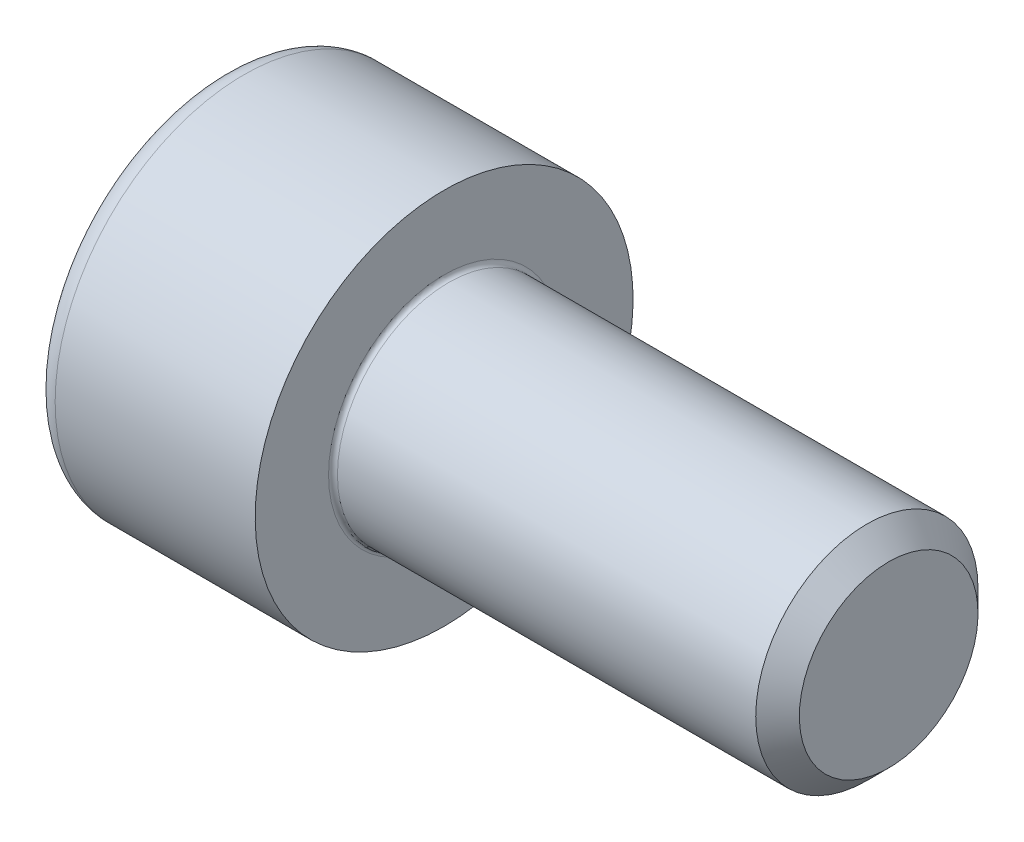
ISO-10303-21;
HEADER;
FILE_DESCRIPTION(('STEP AP214'),'2;1');
FILE_NAME('part.step','',(''),(''),'','','');
FILE_SCHEMA(('AUTOMOTIVE_DESIGN { 1 0 10303 214 1 1 1 1 }'));
ENDSEC;
DATA;
#1=APPLICATION_CONTEXT('core data for automotive mechanical design processes');
#2=APPLICATION_PROTOCOL_DEFINITION('international standard','automotive_design',2000,#1);
#3=PRODUCT_CONTEXT('',#1,'mechanical');
#4=PRODUCT('Part','Part','',(#3));
#5=PRODUCT_RELATED_PRODUCT_CATEGORY('part','',(#4));
#6=PRODUCT_DEFINITION_FORMATION('','',#4);
#7=PRODUCT_DEFINITION_CONTEXT('part definition',#1,'design');
#8=PRODUCT_DEFINITION('design','',#6,#7);
#9=PRODUCT_DEFINITION_SHAPE('','',#8);
#10=(LENGTH_UNIT() NAMED_UNIT(*) SI_UNIT(.MILLI.,.METRE.));
#11=(NAMED_UNIT(*) PLANE_ANGLE_UNIT() SI_UNIT($,.RADIAN.));
#12=(NAMED_UNIT(*) SI_UNIT($,.STERADIAN.) SOLID_ANGLE_UNIT());
#13=UNCERTAINTY_MEASURE_WITH_UNIT(LENGTH_MEASURE(1.E-05),#10,'distance_accuracy_value','');
#14=(GEOMETRIC_REPRESENTATION_CONTEXT(3) GLOBAL_UNCERTAINTY_ASSIGNED_CONTEXT((#13)) GLOBAL_UNIT_ASSIGNED_CONTEXT((#10,
#11,#12)) REPRESENTATION_CONTEXT('',''));
#15=CARTESIAN_POINT('',(0.,0.,0.));
#16=DIRECTION('',(0.,0.,1.));
#17=DIRECTION('',(1.,0.,0.));
#18=AXIS2_PLACEMENT_3D('',#15,#16,#17);
#19=CARTESIAN_POINT('',(-1.83333333333333,0.,0.));
#20=DIRECTION('',(-1.,0.,0.));
#21=DIRECTION('',(0.,1.,0.));
#22=AXIS2_PLACEMENT_3D('',#19,#20,#21);
#23=CONICAL_SURFACE('',#22,1.15470053837925,1.0471975511966);
#24=CARTESIAN_POINT('',(-1.16666666666667,0.,0.));
#25=VERTEX_POINT('',#24);
#26=VERTEX_LOOP('',#25);
#27=FACE_BOUND('',#26,.T.);
#28=CARTESIAN_POINT('',(-2.32136720504591,-2.,0.));
#29=CARTESIAN_POINT('',(-2.32136720504591,-2.,0.535898384862279));
#30=CARTESIAN_POINT('',(-2.5,-2.,1.15470053837933));
#31=(BOUNDED_CURVE() B_SPLINE_CURVE(2,(#28,#29,#30),.UNSPECIFIED.,.F.,
.F.) B_SPLINE_CURVE_WITH_KNOTS((3,3),(0.1168436138078,0.2336872276156),
.UNSPECIFIED.) CURVE() GEOMETRIC_REPRESENTATION_ITEM() RATIONAL_B_SPLINE_CURVE((1.07735026918963,
1.07735026918963,1.)) REPRESENTATION_ITEM(''));
#32=CARTESIAN_POINT('',(-2.32136720504591,-2.,0.));
#33=VERTEX_POINT('',#32);
#34=CARTESIAN_POINT('',(-2.5,-2.,1.15470053837925));
#35=VERTEX_POINT('',#34);
#36=EDGE_CURVE('E29',#33,#35,#31,.T.);
#37=ORIENTED_EDGE('',*,*,#36,.T.);
#38=CARTESIAN_POINT('',(-2.5,-2.00000000000007,1.15470053837921));
#39=CARTESIAN_POINT('',(-2.16666666666664,-1.,1.73205080756888));
#40=CARTESIAN_POINT('',(-2.5,0.,2.30940107675854));
#41=(BOUNDED_CURVE() B_SPLINE_CURVE(2,(#38,#39,#40),.UNSPECIFIED.,.F.,
.F.) B_SPLINE_CURVE_WITH_KNOTS((3,3),(0.,0.2336872276156),
.UNSPECIFIED.) CURVE() GEOMETRIC_REPRESENTATION_ITEM() RATIONAL_B_SPLINE_CURVE((1.,
1.15470053837927,1.)) REPRESENTATION_ITEM(''));
#42=CARTESIAN_POINT('',(-2.5,0.,2.3094010767585));
#43=VERTEX_POINT('',#42);
#44=EDGE_CURVE('E11',#35,#43,#41,.T.);
#45=ORIENTED_EDGE('',*,*,#44,.T.);
#46=CARTESIAN_POINT('',(-2.5,0.,2.30940107675854));
#47=CARTESIAN_POINT('',(-2.16666666666664,1.,1.73205080756888));
#48=CARTESIAN_POINT('',(-2.5,2.00000000000007,1.15470053837921));
#49=(BOUNDED_CURVE() B_SPLINE_CURVE(2,(#46,#47,#48),.UNSPECIFIED.,.F.,
.F.) B_SPLINE_CURVE_WITH_KNOTS((3,3),(0.,0.2336872276156),
.UNSPECIFIED.) CURVE() GEOMETRIC_REPRESENTATION_ITEM() RATIONAL_B_SPLINE_CURVE((1.,
1.15470053837927,1.)) REPRESENTATION_ITEM(''));
#50=CARTESIAN_POINT('',(-2.5,2.,1.15470053837925));
#51=VERTEX_POINT('',#50);
#52=EDGE_CURVE('E92',#43,#51,#49,.T.);
#53=ORIENTED_EDGE('',*,*,#52,.T.);
#54=CARTESIAN_POINT('',(-2.5,2.,1.15470053837933));
#55=CARTESIAN_POINT('',(-2.16666666666664,2.,0.));
#56=CARTESIAN_POINT('',(-2.5,2.,-1.15470053837933));
#57=(BOUNDED_CURVE() B_SPLINE_CURVE(2,(#54,#55,#56),.UNSPECIFIED.,.F.,
.F.) B_SPLINE_CURVE_WITH_KNOTS((3,3),(0.,0.2336872276156),
.UNSPECIFIED.) CURVE() GEOMETRIC_REPRESENTATION_ITEM() RATIONAL_B_SPLINE_CURVE((1.,
1.15470053837927,1.)) REPRESENTATION_ITEM(''));
#58=CARTESIAN_POINT('',(-2.5,2.,-1.15470053837925));
#59=VERTEX_POINT('',#58);
#60=EDGE_CURVE('E114',#51,#59,#57,.T.);
#61=ORIENTED_EDGE('',*,*,#60,.T.);
#62=CARTESIAN_POINT('',(-2.5,2.00000000000007,-1.15470053837921));
#63=CARTESIAN_POINT('',(-2.16666666666664,1.,-1.73205080756888));
#64=CARTESIAN_POINT('',(-2.5,0.,-2.30940107675854));
#65=(BOUNDED_CURVE() B_SPLINE_CURVE(2,(#62,#63,#64),.UNSPECIFIED.,.F.,
.F.) B_SPLINE_CURVE_WITH_KNOTS((3,3),(0.,0.2336872276156),
.UNSPECIFIED.) CURVE() GEOMETRIC_REPRESENTATION_ITEM() RATIONAL_B_SPLINE_CURVE((1.,
1.15470053837927,1.)) REPRESENTATION_ITEM(''));
#66=CARTESIAN_POINT('',(-2.5,0.,-2.3094010767585));
#67=VERTEX_POINT('',#66);
#68=EDGE_CURVE('E169',#59,#67,#65,.T.);
#69=ORIENTED_EDGE('',*,*,#68,.T.);
#70=CARTESIAN_POINT('',(-2.5,0.,-2.30940107675854));
#71=CARTESIAN_POINT('',(-2.16666666666664,-1.,-1.73205080756888));
#72=CARTESIAN_POINT('',(-2.5,-2.00000000000007,-1.15470053837921));
#73=(BOUNDED_CURVE() B_SPLINE_CURVE(2,(#70,#71,#72),.UNSPECIFIED.,.F.,
.F.) B_SPLINE_CURVE_WITH_KNOTS((3,3),(0.,0.2336872276156),
.UNSPECIFIED.) CURVE() GEOMETRIC_REPRESENTATION_ITEM() RATIONAL_B_SPLINE_CURVE((1.,
1.15470053837927,1.)) REPRESENTATION_ITEM(''));
#74=CARTESIAN_POINT('',(-2.5,-2.,-1.15470053837925));
#75=VERTEX_POINT('',#74);
#76=EDGE_CURVE('E188',#67,#75,#73,.T.);
#77=ORIENTED_EDGE('',*,*,#76,.T.);
#78=CARTESIAN_POINT('',(-2.5,-2.,-1.15470053837933));
#79=CARTESIAN_POINT('',(-2.32136720504591,-2.,-0.535898384862279));
#80=CARTESIAN_POINT('',(-2.32136720504591,-2.,0.));
#81=(BOUNDED_CURVE() B_SPLINE_CURVE(2,(#78,#79,#80),.UNSPECIFIED.,.F.,
.F.) B_SPLINE_CURVE_WITH_KNOTS((3,3),(0.,0.1168436138078),
.UNSPECIFIED.) CURVE() GEOMETRIC_REPRESENTATION_ITEM() RATIONAL_B_SPLINE_CURVE((1.,
1.07735026918963,1.07735026918963)) REPRESENTATION_ITEM(''));
#82=EDGE_CURVE('E102',#75,#33,#81,.T.);
#83=ORIENTED_EDGE('',*,*,#82,.T.);
#84=EDGE_LOOP('',(#37,#45,#53,#61,#69,#77,#83));
#85=FACE_BOUND('',#84,.T.);
#86=ADVANCED_FACE('F17',(#27,#85),#23,.F.);
#87=CARTESIAN_POINT('',(-5.,-2.,1.15470053837925));
#88=DIRECTION('',(0.,-0.5,0.866025403784439));
#89=DIRECTION('',(-1.,0.,0.));
#90=AXIS2_PLACEMENT_3D('',#87,#88,#89);
#91=PLANE('',#90);
#92=ORIENTED_EDGE('',*,*,#44,.F.);
#93=DIRECTION('',(-1.,0.,0.));
#94=VECTOR('',#93,1.);
#95=CARTESIAN_POINT('',(-3.75,-2.,1.15470053837925));
#96=LINE('',#95,#94);
#97=CARTESIAN_POINT('',(-5.,-2.,1.15470053837925));
#98=VERTEX_POINT('',#97);
#99=EDGE_CURVE('E128',#35,#98,#96,.T.);
#100=ORIENTED_EDGE('',*,*,#99,.T.);
#101=DIRECTION('',(0.,-0.866025403784439,-0.5));
#102=VECTOR('',#101,1.);
#103=CARTESIAN_POINT('',(-5.,-1.5,1.44337567297407));
#104=LINE('',#103,#102);
#105=CARTESIAN_POINT('',(-5.,0.,2.3094010767585));
#106=VERTEX_POINT('',#105);
#107=EDGE_CURVE('E99',#106,#98,#104,.T.);
#108=ORIENTED_EDGE('',*,*,#107,.F.);
#109=DIRECTION('',(1.,0.,0.));
#110=VECTOR('',#109,1.);
#111=CARTESIAN_POINT('',(-3.75,0.,2.3094010767585));
#112=LINE('',#111,#110);
#113=EDGE_CURVE('E100',#106,#43,#112,.T.);
#114=ORIENTED_EDGE('',*,*,#113,.T.);
#115=EDGE_LOOP('',(#92,#100,#108,#114));
#116=FACE_BOUND('',#115,.T.);
#117=ADVANCED_FACE('F19',(#116),#91,.F.);
#118=CARTESIAN_POINT('',(-5.,-2.,-1.15470053837925));
#119=DIRECTION('',(0.,-1.,0.));
#120=DIRECTION('',(-1.,0.,0.));
#121=AXIS2_PLACEMENT_3D('',#118,#119,#120);
#122=PLANE('',#121);
#123=ORIENTED_EDGE('',*,*,#82,.F.);
#124=DIRECTION('',(-1.,0.,0.));
#125=VECTOR('',#124,1.);
#126=CARTESIAN_POINT('',(-3.75,-2.,-1.15470053837925));
#127=LINE('',#126,#125);
#128=CARTESIAN_POINT('',(-5.,-2.,-1.15470053837925));
#129=VERTEX_POINT('',#128);
#130=EDGE_CURVE('E177',#75,#129,#127,.T.);
#131=ORIENTED_EDGE('',*,*,#130,.T.);
#132=DIRECTION('',(0.,0.,-1.));
#133=VECTOR('',#132,1.);
#134=CARTESIAN_POINT('',(-5.,-2.,-0.577350269189625));
#135=LINE('',#134,#133);
#136=EDGE_CURVE('E218',#98,#129,#135,.T.);
#137=ORIENTED_EDGE('',*,*,#136,.F.);
#138=ORIENTED_EDGE('',*,*,#99,.F.);
#139=ORIENTED_EDGE('',*,*,#36,.F.);
#140=EDGE_LOOP('',(#123,#131,#137,#138,#139));
#141=FACE_BOUND('',#140,.T.);
#142=ADVANCED_FACE('F405',(#141),#122,.F.);
#143=CARTESIAN_POINT('',(-5.,0.,2.3094010767585));
#144=DIRECTION('',(0.,0.5,0.866025403784439));
#145=DIRECTION('',(1.,0.,0.));
#146=AXIS2_PLACEMENT_3D('',#143,#144,#145);
#147=PLANE('',#146);
#148=ORIENTED_EDGE('',*,*,#52,.F.);
#149=ORIENTED_EDGE('',*,*,#113,.F.);
#150=DIRECTION('',(0.,-0.866025403784439,0.5));
#151=VECTOR('',#150,1.);
#152=CARTESIAN_POINT('',(-5.,0.5,2.02072594216369));
#153=LINE('',#152,#151);
#154=CARTESIAN_POINT('',(-5.,2.,1.15470053837925));
#155=VERTEX_POINT('',#154);
#156=EDGE_CURVE('E228',#155,#106,#153,.T.);
#157=ORIENTED_EDGE('',*,*,#156,.F.);
#158=DIRECTION('',(-1.,0.,0.));
#159=VECTOR('',#158,1.);
#160=CARTESIAN_POINT('',(-3.75,2.,1.15470053837925));
#161=LINE('',#160,#159);
#162=EDGE_CURVE('E110',#51,#155,#161,.T.);
#163=ORIENTED_EDGE('',*,*,#162,.F.);
#164=EDGE_LOOP('',(#148,#149,#157,#163));
#165=FACE_BOUND('',#164,.T.);
#166=ADVANCED_FACE('F106',(#165),#147,.F.);
#167=CARTESIAN_POINT('',(-5.,2.,1.15470053837925));
#168=DIRECTION('',(0.,1.,0.));
#169=DIRECTION('',(0.,0.,-1.));
#170=AXIS2_PLACEMENT_3D('',#167,#168,#169);
#171=PLANE('',#170);
#172=ORIENTED_EDGE('',*,*,#60,.F.);
#173=ORIENTED_EDGE('',*,*,#162,.T.);
#174=DIRECTION('',(0.,0.,1.));
#175=VECTOR('',#174,1.);
#176=CARTESIAN_POINT('',(-5.,2.,0.577350269189625));
#177=LINE('',#176,#175);
#178=CARTESIAN_POINT('',(-5.,2.,-1.15470053837925));
#179=VERTEX_POINT('',#178);
#180=EDGE_CURVE('E235',#179,#155,#177,.T.);
#181=ORIENTED_EDGE('',*,*,#180,.F.);
#182=DIRECTION('',(-1.,0.,0.));
#183=VECTOR('',#182,1.);
#184=CARTESIAN_POINT('',(-3.75,2.,-1.15470053837925));
#185=LINE('',#184,#183);
#186=EDGE_CURVE('E164',#59,#179,#185,.T.);
#187=ORIENTED_EDGE('',*,*,#186,.F.);
#188=EDGE_LOOP('',(#172,#173,#181,#187));
#189=FACE_BOUND('',#188,.T.);
#190=ADVANCED_FACE('F415',(#189),#171,.F.);
#191=CARTESIAN_POINT('',(-5.,2.,-1.15470053837925));
#192=DIRECTION('',(0.,0.5,-0.866025403784439));
#193=DIRECTION('',(-1.,0.,0.));
#194=AXIS2_PLACEMENT_3D('',#191,#192,#193);
#195=PLANE('',#194);
#196=ORIENTED_EDGE('',*,*,#68,.F.);
#197=ORIENTED_EDGE('',*,*,#186,.T.);
#198=DIRECTION('',(0.,0.866025403784439,0.5));
#199=VECTOR('',#198,1.);
#200=CARTESIAN_POINT('',(-5.,1.5,-1.44337567297407));
#201=LINE('',#200,#199);
#202=CARTESIAN_POINT('',(-5.,0.,-2.3094010767585));
#203=VERTEX_POINT('',#202);
#204=EDGE_CURVE('E205',#203,#179,#201,.T.);
#205=ORIENTED_EDGE('',*,*,#204,.F.);
#206=DIRECTION('',(-1.,0.,0.));
#207=VECTOR('',#206,1.);
#208=CARTESIAN_POINT('',(-3.75,0.,-2.3094010767585));
#209=LINE('',#208,#207);
#210=EDGE_CURVE('E182',#67,#203,#209,.T.);
#211=ORIENTED_EDGE('',*,*,#210,.F.);
#212=EDGE_LOOP('',(#196,#197,#205,#211));
#213=FACE_BOUND('',#212,.T.);
#214=ADVANCED_FACE('F420',(#213),#195,.F.);
#215=CARTESIAN_POINT('',(-5.,0.,-2.3094010767585));
#216=DIRECTION('',(0.,-0.5,-0.866025403784439));
#217=DIRECTION('',(0.,-0.866025403784439,0.5));
#218=AXIS2_PLACEMENT_3D('',#215,#216,#217);
#219=PLANE('',#218);
#220=ORIENTED_EDGE('',*,*,#76,.F.);
#221=ORIENTED_EDGE('',*,*,#210,.T.);
#222=DIRECTION('',(0.,0.866025403784439,-0.5));
#223=VECTOR('',#222,1.);
#224=CARTESIAN_POINT('',(-5.,-0.5,-2.02072594216369));
#225=LINE('',#224,#223);
#226=EDGE_CURVE('E210',#129,#203,#225,.T.);
#227=ORIENTED_EDGE('',*,*,#226,.F.);
#228=ORIENTED_EDGE('',*,*,#130,.F.);
#229=EDGE_LOOP('',(#220,#221,#227,#228));
#230=FACE_BOUND('',#229,.T.);
#231=ADVANCED_FACE('F416',(#230),#219,.F.);
#232=CARTESIAN_POINT('',(-2.5,0.,0.));
#233=DIRECTION('',(1.,0.,0.));
#234=DIRECTION('',(0.,1.,0.));
#235=AXIS2_PLACEMENT_3D('',#232,#233,#234);
#236=CYLINDRICAL_SURFACE('',#235,4.25);
#237=CARTESIAN_POINT('',(0.,0.,0.));
#238=DIRECTION('',(1.,0.,0.));
#239=DIRECTION('',(0.,1.,0.));
#240=AXIS2_PLACEMENT_3D('',#237,#238,#239);
#241=CIRCLE('',#240,4.25);
#242=CARTESIAN_POINT('',(0.,-4.25,0.));
#243=VERTEX_POINT('',#242);
#244=EDGE_CURVE('E266',#243,#243,#241,.T.);
#245=ORIENTED_EDGE('',*,*,#244,.F.);
#246=DIRECTION('',(-1.,0.,0.));
#247=VECTOR('',#246,1.);
#248=CARTESIAN_POINT('',(-2.50000000000004,-4.25,0.));
#249=LINE('',#248,#247);
#250=CARTESIAN_POINT('',(-4.5,-4.25,0.));
#251=VERTEX_POINT('',#250);
#252=EDGE_CURVE('E194',#243,#251,#249,.T.);
#253=ORIENTED_EDGE('',*,*,#252,.T.);
#254=CARTESIAN_POINT('',(-4.5,0.,0.));
#255=DIRECTION('',(-1.,0.,0.));
#256=DIRECTION('',(0.,-1.,0.));
#257=AXIS2_PLACEMENT_3D('',#254,#255,#256);
#258=CIRCLE('',#257,4.25);
#259=CARTESIAN_POINT('',(-4.5,0.,4.25));
#260=VERTEX_POINT('',#259);
#261=EDGE_CURVE('E250',#260,#251,#258,.T.);
#262=ORIENTED_EDGE('',*,*,#261,.F.);
#263=CARTESIAN_POINT('',(-4.5,0.,0.));
#264=DIRECTION('',(-1.,0.,0.));
#265=DIRECTION('',(0.,-1.,0.));
#266=AXIS2_PLACEMENT_3D('',#263,#264,#265);
#267=CIRCLE('',#266,4.25);
#268=EDGE_CURVE('E241',#251,#260,#267,.T.);
#269=ORIENTED_EDGE('',*,*,#268,.F.);
#270=ORIENTED_EDGE('',*,*,#252,.F.);
#271=EDGE_LOOP('',(#245,#253,#262,#269,#270));
#272=FACE_BOUND('',#271,.T.);
#273=ADVANCED_FACE('F379',(#272),#236,.T.);
#274=CARTESIAN_POINT('',(-5.,3.27970053837925,0.));
#275=DIRECTION('',(-1.,0.,0.));
#276=DIRECTION('',(0.,1.,0.));
#277=AXIS2_PLACEMENT_3D('',#274,#275,#276);
#278=PLANE('',#277);
#279=ORIENTED_EDGE('',*,*,#180,.T.);
#280=ORIENTED_EDGE('',*,*,#156,.T.);
#281=ORIENTED_EDGE('',*,*,#107,.T.);
#282=ORIENTED_EDGE('',*,*,#136,.T.);
#283=ORIENTED_EDGE('',*,*,#226,.T.);
#284=ORIENTED_EDGE('',*,*,#204,.T.);
#285=EDGE_LOOP('',(#279,#280,#281,#282,#283,#284));
#286=FACE_BOUND('',#285,.T.);
#287=CARTESIAN_POINT('',(-5.,0.,0.));
#288=DIRECTION('',(1.,0.,0.));
#289=DIRECTION('',(0.,-1.,0.));
#290=AXIS2_PLACEMENT_3D('',#287,#288,#289);
#291=CIRCLE('',#290,3.75);
#292=CARTESIAN_POINT('',(-5.,0.,3.75));
#293=VERTEX_POINT('',#292);
#294=EDGE_CURVE('E240',#293,#293,#291,.T.);
#295=ORIENTED_EDGE('',*,*,#294,.F.);
#296=EDGE_LOOP('',(#295));
#297=FACE_BOUND('',#296,.T.);
#298=ADVANCED_FACE('F406',(#286,#297),#278,.T.);
#299=CARTESIAN_POINT('',(-4.5,0.,0.));
#300=DIRECTION('',(1.,0.,0.));
#301=DIRECTION('',(0.,0.,-1.));
#302=AXIS2_PLACEMENT_3D('',#299,#300,#301);
#303=TOROIDAL_SURFACE('',#302,3.75,0.5);
#304=ORIENTED_EDGE('',*,*,#261,.T.);
#305=ORIENTED_EDGE('',*,*,#268,.T.);
#306=CARTESIAN_POINT('',(-4.5,0.,3.75));
#307=DIRECTION('',(0.,-1.,0.));
#308=DIRECTION('',(0.,0.,1.));
#309=AXIS2_PLACEMENT_3D('',#306,#307,#308);
#310=CIRCLE('',#309,0.5);
#311=EDGE_CURVE('E246',#260,#293,#310,.T.);
#312=ORIENTED_EDGE('',*,*,#311,.T.);
#313=ORIENTED_EDGE('',*,*,#294,.T.);
#314=ORIENTED_EDGE('',*,*,#311,.F.);
#315=EDGE_LOOP('',(#304,#305,#312,#313,#314));
#316=FACE_BOUND('',#315,.T.);
#317=ADVANCED_FACE('F383',(#316),#303,.T.);
#318=CARTESIAN_POINT('',(10.,1.25,0.));
#319=DIRECTION('',(1.,0.,0.));
#320=DIRECTION('',(0.,1.,0.));
#321=AXIS2_PLACEMENT_3D('',#318,#319,#320);
#322=PLANE('',#321);
#323=CARTESIAN_POINT('',(10.,0.,0.));
#324=DIRECTION('',(-1.,0.,0.));
#325=DIRECTION('',(0.,-1.,0.));
#326=AXIS2_PLACEMENT_3D('',#323,#324,#325);
#327=CIRCLE('',#326,2.00924);
#328=CARTESIAN_POINT('',(10.,2.00924,0.));
#329=VERTEX_POINT('',#328);
#330=EDGE_CURVE('E268',#329,#329,#327,.T.);
#331=ORIENTED_EDGE('',*,*,#330,.F.);
#332=EDGE_LOOP('',(#331));
#333=FACE_BOUND('',#332,.T.);
#334=ADVANCED_FACE('F499',(#333),#322,.T.);
#335=CARTESIAN_POINT('',(9.75462,0.,0.));
#336=DIRECTION('',(-1.,0.,0.));
#337=DIRECTION('',(0.,-1.,0.));
#338=AXIS2_PLACEMENT_3D('',#335,#336,#337);
#339=CONICAL_SURFACE('',#338,2.25462,0.785398163397448);
#340=ORIENTED_EDGE('',*,*,#330,.T.);
#341=DIRECTION('',(-0.707106781186562,0.707106781186533,0.));
#342=VECTOR('',#341,1.);
#343=CARTESIAN_POINT('',(9.75462,2.25462,0.));
#344=LINE('',#343,#342);
#345=CARTESIAN_POINT('',(9.50924,2.5,0.));
#346=VERTEX_POINT('',#345);
#347=EDGE_CURVE('E256',#329,#346,#344,.T.);
#348=ORIENTED_EDGE('',*,*,#347,.T.);
#349=CARTESIAN_POINT('',(9.50924,0.,0.));
#350=DIRECTION('',(1.,0.,0.));
#351=DIRECTION('',(0.,-1.,0.));
#352=AXIS2_PLACEMENT_3D('',#349,#350,#351);
#353=CIRCLE('',#352,2.5);
#354=CARTESIAN_POINT('',(9.50924,-2.5,0.));
#355=VERTEX_POINT('',#354);
#356=EDGE_CURVE('E293',#346,#355,#353,.T.);
#357=ORIENTED_EDGE('',*,*,#356,.T.);
#358=CARTESIAN_POINT('',(9.50924,0.,0.));
#359=DIRECTION('',(1.,0.,0.));
#360=DIRECTION('',(0.,-1.,0.));
#361=AXIS2_PLACEMENT_3D('',#358,#359,#360);
#362=CIRCLE('',#361,2.5);
#363=EDGE_CURVE('E290',#355,#346,#362,.T.);
#364=ORIENTED_EDGE('',*,*,#363,.T.);
#365=ORIENTED_EDGE('',*,*,#347,.F.);
#366=EDGE_LOOP('',(#340,#348,#357,#364,#365));
#367=FACE_BOUND('',#366,.T.);
#368=ADVANCED_FACE('F368',(#367),#339,.T.);
#369=CARTESIAN_POINT('',(0.,3.375,0.));
#370=DIRECTION('',(1.,0.,0.));
#371=DIRECTION('',(0.,1.,0.));
#372=AXIS2_PLACEMENT_3D('',#369,#370,#371);
#373=PLANE('',#372);
#374=CARTESIAN_POINT('',(0.,0.,0.));
#375=DIRECTION('',(1.,0.,0.));
#376=DIRECTION('',(0.,-1.,0.));
#377=AXIS2_PLACEMENT_3D('',#374,#375,#376);
#378=CIRCLE('',#377,2.6);
#379=CARTESIAN_POINT('',(0.,0.,2.6));
#380=VERTEX_POINT('',#379);
#381=EDGE_CURVE('E332',#380,#380,#378,.T.);
#382=ORIENTED_EDGE('',*,*,#381,.F.);
#383=EDGE_LOOP('',(#382));
#384=FACE_BOUND('',#383,.T.);
#385=ORIENTED_EDGE('',*,*,#244,.T.);
#386=EDGE_LOOP('',(#385));
#387=FACE_BOUND('',#386,.T.);
#388=ADVANCED_FACE('F363',(#384,#387),#373,.T.);
#389=CARTESIAN_POINT('',(6.,0.,0.));
#390=DIRECTION('',(1.,0.,0.));
#391=DIRECTION('',(0.,1.,0.));
#392=AXIS2_PLACEMENT_3D('',#389,#390,#391);
#393=CYLINDRICAL_SURFACE('',#392,2.5);
#394=ORIENTED_EDGE('',*,*,#356,.F.);
#395=ORIENTED_EDGE('',*,*,#363,.F.);
#396=DIRECTION('',(-1.,0.,0.));
#397=VECTOR('',#396,1.);
#398=CARTESIAN_POINT('',(6.,-2.5,0.));
#399=LINE('',#398,#397);
#400=CARTESIAN_POINT('',(0.0999999999999712,-2.5,0.));
#401=VERTEX_POINT('',#400);
#402=EDGE_CURVE('E274',#355,#401,#399,.T.);
#403=ORIENTED_EDGE('',*,*,#402,.T.);
#404=CARTESIAN_POINT('',(0.100000000000002,0.,0.));
#405=DIRECTION('',(-1.,0.,0.));
#406=DIRECTION('',(0.,-1.,0.));
#407=AXIS2_PLACEMENT_3D('',#404,#405,#406);
#408=CIRCLE('',#407,2.5);
#409=CARTESIAN_POINT('',(0.100000000000002,0.,2.5));
#410=VERTEX_POINT('',#409);
#411=EDGE_CURVE('E313',#410,#401,#408,.T.);
#412=ORIENTED_EDGE('',*,*,#411,.F.);
#413=CARTESIAN_POINT('',(0.100000000000002,0.,0.));
#414=DIRECTION('',(-1.,0.,0.));
#415=DIRECTION('',(0.,-1.,0.));
#416=AXIS2_PLACEMENT_3D('',#413,#414,#415);
#417=CIRCLE('',#416,2.5);
#418=EDGE_CURVE('E306',#401,#410,#417,.T.);
#419=ORIENTED_EDGE('',*,*,#418,.F.);
#420=ORIENTED_EDGE('',*,*,#402,.F.);
#421=EDGE_LOOP('',(#394,#395,#403,#412,#419,#420));
#422=FACE_BOUND('',#421,.T.);
#423=ADVANCED_FACE('F370',(#422),#393,.T.);
#424=CARTESIAN_POINT('',(0.100000000000002,0.,0.));
#425=DIRECTION('',(1.,0.,0.));
#426=DIRECTION('',(0.,0.,-1.));
#427=AXIS2_PLACEMENT_3D('',#424,#425,#426);
#428=TOROIDAL_SURFACE('',#427,2.6,0.1);
#429=ORIENTED_EDGE('',*,*,#381,.T.);
#430=CARTESIAN_POINT('',(0.100000000000002,0.,2.6));
#431=DIRECTION('',(0.,-1.,0.));
#432=DIRECTION('',(0.,0.,1.));
#433=AXIS2_PLACEMENT_3D('',#430,#431,#432);
#434=CIRCLE('',#433,0.1);
#435=EDGE_CURVE('E318',#380,#410,#434,.T.);
#436=ORIENTED_EDGE('',*,*,#435,.T.);
#437=ORIENTED_EDGE('',*,*,#411,.T.);
#438=ORIENTED_EDGE('',*,*,#418,.T.);
#439=ORIENTED_EDGE('',*,*,#435,.F.);
#440=EDGE_LOOP('',(#429,#436,#437,#438,#439));
#441=FACE_BOUND('',#440,.T.);
#442=ADVANCED_FACE('F356',(#441),#428,.F.);
#443=CLOSED_SHELL('',(#86,#117,#142,#166,#190,#214,#231,#273,#298,#317,#334,#368,#388,#423,#442));
#444=MANIFOLD_SOLID_BREP('B1',#443);
#445=ADVANCED_BREP_SHAPE_REPRESENTATION('',(#18,#444),#14);
#446=SHAPE_DEFINITION_REPRESENTATION(#9,#445);
ENDSEC;
END-ISO-10303-21;
